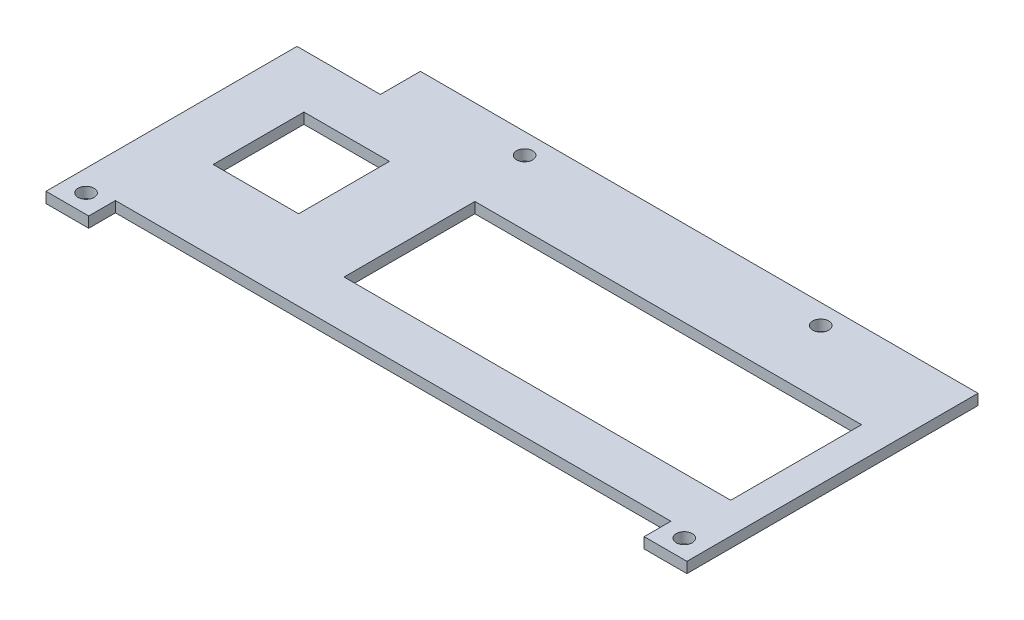
ISO-10303-21;
HEADER;
FILE_DESCRIPTION(('STEP AP214'),'2;1');
FILE_NAME('part.step','',(''),(''),'','','');
FILE_SCHEMA(('AUTOMOTIVE_DESIGN { 1 0 10303 214 1 1 1 1 }'));
ENDSEC;
DATA;
#1=APPLICATION_CONTEXT('core data for automotive mechanical design processes');
#2=APPLICATION_PROTOCOL_DEFINITION('international standard','automotive_design',2000,#1);
#3=PRODUCT_CONTEXT('',#1,'mechanical');
#4=PRODUCT('Part','Part','',(#3));
#5=PRODUCT_RELATED_PRODUCT_CATEGORY('part','',(#4));
#6=PRODUCT_DEFINITION_FORMATION('','',#4);
#7=PRODUCT_DEFINITION_CONTEXT('part definition',#1,'design');
#8=PRODUCT_DEFINITION('design','',#6,#7);
#9=PRODUCT_DEFINITION_SHAPE('','',#8);
#10=(LENGTH_UNIT() NAMED_UNIT(*) SI_UNIT(.MILLI.,.METRE.));
#11=(NAMED_UNIT(*) PLANE_ANGLE_UNIT() SI_UNIT($,.RADIAN.));
#12=(NAMED_UNIT(*) SI_UNIT($,.STERADIAN.) SOLID_ANGLE_UNIT());
#13=UNCERTAINTY_MEASURE_WITH_UNIT(LENGTH_MEASURE(1.E-05),#10,'distance_accuracy_value','');
#14=(GEOMETRIC_REPRESENTATION_CONTEXT(3) GLOBAL_UNCERTAINTY_ASSIGNED_CONTEXT((#13)) GLOBAL_UNIT_ASSIGNED_CONTEXT((#10,
#11,#12)) REPRESENTATION_CONTEXT('',''));
#15=CARTESIAN_POINT('',(0.,0.,0.));
#16=DIRECTION('',(0.,0.,1.));
#17=DIRECTION('',(1.,0.,0.));
#18=AXIS2_PLACEMENT_3D('',#15,#16,#17);
#19=CARTESIAN_POINT('',(0.,21.5,0.));
#20=DIRECTION('',(0.,-1.,0.));
#21=DIRECTION('',(0.,0.,-1.));
#22=AXIS2_PLACEMENT_3D('',#19,#20,#21);
#23=PLANE('',#22);
#24=DIRECTION('',(0.,0.,1.));
#25=VECTOR('',#24,1.);
#26=CARTESIAN_POINT('',(-44.4,21.5,18.));
#27=LINE('',#26,#25);
#28=CARTESIAN_POINT('',(-44.4,21.5,18.));
#29=VERTEX_POINT('',#28);
#30=CARTESIAN_POINT('',(-44.4,21.5,25.5));
#31=VERTEX_POINT('',#30);
#32=EDGE_CURVE('E54',#29,#31,#27,.T.);
#33=ORIENTED_EDGE('',*,*,#32,.F.);
#34=DIRECTION('',(-1.,0.,0.));
#35=VECTOR('',#34,1.);
#36=CARTESIAN_POINT('',(58.,21.5,18.));
#37=LINE('',#36,#35);
#38=CARTESIAN_POINT('',(60.,21.5,18.));
#39=VERTEX_POINT('',#38);
#40=EDGE_CURVE('E152',#39,#29,#37,.T.);
#41=ORIENTED_EDGE('',*,*,#40,.F.);
#42=DIRECTION('',(0.,0.,-1.));
#43=VECTOR('',#42,1.);
#44=CARTESIAN_POINT('',(60.,21.5,72.5));
#45=LINE('',#44,#43);
#46=CARTESIAN_POINT('',(60.,21.5,72.5));
#47=VERTEX_POINT('',#46);
#48=EDGE_CURVE('E214',#47,#39,#45,.T.);
#49=ORIENTED_EDGE('',*,*,#48,.F.);
#50=DIRECTION('',(1.,0.,0.));
#51=VECTOR('',#50,1.);
#52=CARTESIAN_POINT('',(52.,21.5,72.5));
#53=LINE('',#52,#51);
#54=CARTESIAN_POINT('',(52.,21.5,72.5));
#55=VERTEX_POINT('',#54);
#56=EDGE_CURVE('E183',#55,#47,#53,.T.);
#57=ORIENTED_EDGE('',*,*,#56,.F.);
#58=DIRECTION('',(0.,0.,1.));
#59=VECTOR('',#58,1.);
#60=CARTESIAN_POINT('',(52.,21.5,67.5));
#61=LINE('',#60,#59);
#62=CARTESIAN_POINT('',(52.,21.5,67.5));
#63=VERTEX_POINT('',#62);
#64=EDGE_CURVE('E227',#63,#55,#61,.T.);
#65=ORIENTED_EDGE('',*,*,#64,.F.);
#66=DIRECTION('',(1.,0.,0.));
#67=VECTOR('',#66,1.);
#68=CARTESIAN_POINT('',(-52.,21.5,67.5));
#69=LINE('',#68,#67);
#70=CARTESIAN_POINT('',(-52.,21.5,67.5));
#71=VERTEX_POINT('',#70);
#72=EDGE_CURVE('E225',#71,#63,#69,.T.);
#73=ORIENTED_EDGE('',*,*,#72,.F.);
#74=DIRECTION('',(0.,0.,-1.));
#75=VECTOR('',#74,1.);
#76=CARTESIAN_POINT('',(-52.,21.5,72.5));
#77=LINE('',#76,#75);
#78=CARTESIAN_POINT('',(-52.,21.5,72.5));
#79=VERTEX_POINT('',#78);
#80=EDGE_CURVE('E223',#79,#71,#77,.T.);
#81=ORIENTED_EDGE('',*,*,#80,.F.);
#82=DIRECTION('',(1.,0.,0.));
#83=VECTOR('',#82,1.);
#84=CARTESIAN_POINT('',(-60.,21.5,72.5));
#85=LINE('',#84,#83);
#86=CARTESIAN_POINT('',(-60.,21.5,72.5));
#87=VERTEX_POINT('',#86);
#88=EDGE_CURVE('E189',#87,#79,#85,.T.);
#89=ORIENTED_EDGE('',*,*,#88,.F.);
#90=DIRECTION('',(0.,0.,1.));
#91=VECTOR('',#90,1.);
#92=CARTESIAN_POINT('',(-60.,21.5,52.5));
#93=LINE('',#92,#91);
#94=CARTESIAN_POINT('',(-60.,21.5,25.5));
#95=VERTEX_POINT('',#94);
#96=EDGE_CURVE('E186',#95,#87,#93,.T.);
#97=ORIENTED_EDGE('',*,*,#96,.F.);
#98=DIRECTION('',(1.,0.,0.));
#99=VECTOR('',#98,1.);
#100=CARTESIAN_POINT('',(-16.9,21.5,25.5));
#101=LINE('',#100,#99);
#102=EDGE_CURVE('E174',#95,#31,#101,.T.);
#103=ORIENTED_EDGE('',*,*,#102,.T.);
#104=EDGE_LOOP('',(#33,#41,#49,#57,#65,#73,#81,#89,#97,#103));
#105=FACE_BOUND('',#104,.T.);
#106=CARTESIAN_POINT('',(-21.029637867963,21.5,21.8623873910983));
#107=DIRECTION('',(0.,1.,0.));
#108=DIRECTION('',(0.,0.,1.));
#109=AXIS2_PLACEMENT_3D('',#106,#107,#108);
#110=CIRCLE('',#109,1.5);
#111=CARTESIAN_POINT('',(-21.029637867963,21.5,23.3623873910983));
#112=VERTEX_POINT('',#111);
#113=EDGE_CURVE('E315',#112,#112,#110,.T.);
#114=ORIENTED_EDGE('',*,*,#113,.T.);
#115=EDGE_LOOP('',(#114));
#116=FACE_BOUND('',#115,.T.);
#117=CARTESIAN_POINT('',(34.3,21.5,21.75));
#118=DIRECTION('',(0.,1.,0.));
#119=DIRECTION('',(0.,0.,1.));
#120=AXIS2_PLACEMENT_3D('',#117,#118,#119);
#121=CIRCLE('',#120,1.5);
#122=CARTESIAN_POINT('',(34.3,21.5,23.25));
#123=VERTEX_POINT('',#122);
#124=EDGE_CURVE('E588',#123,#123,#121,.T.);
#125=ORIENTED_EDGE('',*,*,#124,.T.);
#126=EDGE_LOOP('',(#125));
#127=FACE_BOUND('',#126,.T.);
#128=CARTESIAN_POINT('',(-56.,21.5,69.));
#129=DIRECTION('',(0.,1.,0.));
#130=DIRECTION('',(0.,0.,1.));
#131=AXIS2_PLACEMENT_3D('',#128,#129,#130);
#132=CIRCLE('',#131,1.5);
#133=CARTESIAN_POINT('',(-56.,21.5,70.5));
#134=VERTEX_POINT('',#133);
#135=EDGE_CURVE('E45',#134,#134,#132,.T.);
#136=ORIENTED_EDGE('',*,*,#135,.T.);
#137=EDGE_LOOP('',(#136));
#138=FACE_BOUND('',#137,.T.);
#139=CARTESIAN_POINT('',(56.,21.5,69.));
#140=DIRECTION('',(0.,1.,0.));
#141=DIRECTION('',(0.,0.,1.));
#142=AXIS2_PLACEMENT_3D('',#139,#140,#141);
#143=CIRCLE('',#142,1.5);
#144=CARTESIAN_POINT('',(56.,21.5,70.5));
#145=VERTEX_POINT('',#144);
#146=EDGE_CURVE('E11',#145,#145,#143,.T.);
#147=ORIENTED_EDGE('',*,*,#146,.T.);
#148=EDGE_LOOP('',(#147));
#149=FACE_BOUND('',#148,.T.);
#150=DIRECTION('',(1.,0.,0.));
#151=VECTOR('',#150,1.);
#152=CARTESIAN_POINT('',(54.2,21.5,58.5));
#153=LINE('',#152,#151);
#154=CARTESIAN_POINT('',(-18.2,21.5,58.5));
#155=VERTEX_POINT('',#154);
#156=CARTESIAN_POINT('',(54.2,21.5,58.5));
#157=VERTEX_POINT('',#156);
#158=EDGE_CURVE('E258',#155,#157,#153,.T.);
#159=ORIENTED_EDGE('',*,*,#158,.T.);
#160=DIRECTION('',(0.,0.,-1.));
#161=VECTOR('',#160,1.);
#162=CARTESIAN_POINT('',(54.2,21.5,34.));
#163=LINE('',#162,#161);
#164=CARTESIAN_POINT('',(54.2,21.5,34.));
#165=VERTEX_POINT('',#164);
#166=EDGE_CURVE('E254',#157,#165,#163,.T.);
#167=ORIENTED_EDGE('',*,*,#166,.T.);
#168=DIRECTION('',(-1.,0.,0.));
#169=VECTOR('',#168,1.);
#170=CARTESIAN_POINT('',(54.2,21.5,34.));
#171=LINE('',#170,#169);
#172=CARTESIAN_POINT('',(-18.2,21.5,34.));
#173=VERTEX_POINT('',#172);
#174=EDGE_CURVE('E268',#165,#173,#171,.T.);
#175=ORIENTED_EDGE('',*,*,#174,.T.);
#176=DIRECTION('',(0.,0.,1.));
#177=VECTOR('',#176,1.);
#178=CARTESIAN_POINT('',(-18.2,21.5,34.));
#179=LINE('',#178,#177);
#180=EDGE_CURVE('E271',#173,#155,#179,.T.);
#181=ORIENTED_EDGE('',*,*,#180,.T.);
#182=EDGE_LOOP('',(#159,#167,#175,#181));
#183=FACE_BOUND('',#182,.T.);
#184=DIRECTION('',(-1.,0.,0.));
#185=VECTOR('',#184,1.);
#186=CARTESIAN_POINT('',(-48.7,21.5,35.5));
#187=LINE('',#186,#185);
#188=CARTESIAN_POINT('',(-32.7,21.5,35.5));
#189=VERTEX_POINT('',#188);
#190=CARTESIAN_POINT('',(-48.7,21.5,35.5));
#191=VERTEX_POINT('',#190);
#192=EDGE_CURVE('E232',#189,#191,#187,.T.);
#193=ORIENTED_EDGE('',*,*,#192,.T.);
#194=DIRECTION('',(0.,0.,1.));
#195=VECTOR('',#194,1.);
#196=CARTESIAN_POINT('',(-48.7,21.5,35.5));
#197=LINE('',#196,#195);
#198=CARTESIAN_POINT('',(-48.7,21.5,52.5));
#199=VERTEX_POINT('',#198);
#200=EDGE_CURVE('E138',#191,#199,#197,.T.);
#201=ORIENTED_EDGE('',*,*,#200,.T.);
#202=DIRECTION('',(1.,0.,0.));
#203=VECTOR('',#202,1.);
#204=CARTESIAN_POINT('',(-48.7,21.5,52.5));
#205=LINE('',#204,#203);
#206=CARTESIAN_POINT('',(-32.7,21.5,52.5));
#207=VERTEX_POINT('',#206);
#208=EDGE_CURVE('E240',#199,#207,#205,.T.);
#209=ORIENTED_EDGE('',*,*,#208,.T.);
#210=DIRECTION('',(0.,0.,-1.));
#211=VECTOR('',#210,1.);
#212=CARTESIAN_POINT('',(-32.7,21.5,35.5));
#213=LINE('',#212,#211);
#214=EDGE_CURVE('E243',#207,#189,#213,.T.);
#215=ORIENTED_EDGE('',*,*,#214,.T.);
#216=EDGE_LOOP('',(#193,#201,#209,#215));
#217=FACE_BOUND('',#216,.T.);
#218=ADVANCED_FACE('F35',(#105,#116,#127,#138,#149,#183,#217),#23,.T.);
#219=CARTESIAN_POINT('',(-32.7,23.5,35.5));
#220=DIRECTION('',(-1.,0.,0.));
#221=DIRECTION('',(0.,0.,1.));
#222=AXIS2_PLACEMENT_3D('',#219,#220,#221);
#223=PLANE('',#222);
#224=ORIENTED_EDGE('',*,*,#214,.F.);
#225=DIRECTION('',(0.,-1.,0.));
#226=VECTOR('',#225,1.);
#227=CARTESIAN_POINT('',(-32.7,23.5,52.5));
#228=LINE('',#227,#226);
#229=CARTESIAN_POINT('',(-32.7,23.5,52.5));
#230=VERTEX_POINT('',#229);
#231=EDGE_CURVE('E250',#230,#207,#228,.T.);
#232=ORIENTED_EDGE('',*,*,#231,.F.);
#233=DIRECTION('',(0.,0.,-1.));
#234=VECTOR('',#233,1.);
#235=CARTESIAN_POINT('',(-32.7,23.5,35.5));
#236=LINE('',#235,#234);
#237=CARTESIAN_POINT('',(-32.7,23.5,35.5));
#238=VERTEX_POINT('',#237);
#239=EDGE_CURVE('E234',#230,#238,#236,.T.);
#240=ORIENTED_EDGE('',*,*,#239,.T.);
#241=DIRECTION('',(0.,-1.,0.));
#242=VECTOR('',#241,1.);
#243=CARTESIAN_POINT('',(-32.7,23.5,35.5));
#244=LINE('',#243,#242);
#245=EDGE_CURVE('E144',#238,#189,#244,.T.);
#246=ORIENTED_EDGE('',*,*,#245,.T.);
#247=EDGE_LOOP('',(#224,#232,#240,#246));
#248=FACE_BOUND('',#247,.T.);
#249=ADVANCED_FACE('F360',(#248),#223,.T.);
#250=CARTESIAN_POINT('',(-48.7,23.5,52.5));
#251=DIRECTION('',(0.,0.,-1.));
#252=DIRECTION('',(-1.,0.,0.));
#253=AXIS2_PLACEMENT_3D('',#250,#251,#252);
#254=PLANE('',#253);
#255=ORIENTED_EDGE('',*,*,#208,.F.);
#256=DIRECTION('',(0.,-1.,0.));
#257=VECTOR('',#256,1.);
#258=CARTESIAN_POINT('',(-48.7,23.5,52.5));
#259=LINE('',#258,#257);
#260=CARTESIAN_POINT('',(-48.7,23.5,52.5));
#261=VERTEX_POINT('',#260);
#262=EDGE_CURVE('E252',#261,#199,#259,.T.);
#263=ORIENTED_EDGE('',*,*,#262,.F.);
#264=DIRECTION('',(1.,0.,0.));
#265=VECTOR('',#264,1.);
#266=CARTESIAN_POINT('',(-48.7,23.5,52.5));
#267=LINE('',#266,#265);
#268=EDGE_CURVE('E231',#261,#230,#267,.T.);
#269=ORIENTED_EDGE('',*,*,#268,.T.);
#270=ORIENTED_EDGE('',*,*,#231,.T.);
#271=EDGE_LOOP('',(#255,#263,#269,#270));
#272=FACE_BOUND('',#271,.T.);
#273=ADVANCED_FACE('F366',(#272),#254,.T.);
#274=CARTESIAN_POINT('',(-48.7,23.5,35.5));
#275=DIRECTION('',(1.,0.,0.));
#276=DIRECTION('',(0.,0.,-1.));
#277=AXIS2_PLACEMENT_3D('',#274,#275,#276);
#278=PLANE('',#277);
#279=ORIENTED_EDGE('',*,*,#200,.F.);
#280=DIRECTION('',(0.,-1.,0.));
#281=VECTOR('',#280,1.);
#282=CARTESIAN_POINT('',(-48.7,23.5,35.5));
#283=LINE('',#282,#281);
#284=CARTESIAN_POINT('',(-48.7,23.5,35.5));
#285=VERTEX_POINT('',#284);
#286=EDGE_CURVE('E238',#285,#191,#283,.T.);
#287=ORIENTED_EDGE('',*,*,#286,.F.);
#288=DIRECTION('',(0.,0.,1.));
#289=VECTOR('',#288,1.);
#290=CARTESIAN_POINT('',(-48.7,23.5,35.5));
#291=LINE('',#290,#289);
#292=EDGE_CURVE('E229',#285,#261,#291,.T.);
#293=ORIENTED_EDGE('',*,*,#292,.T.);
#294=ORIENTED_EDGE('',*,*,#262,.T.);
#295=EDGE_LOOP('',(#279,#287,#293,#294));
#296=FACE_BOUND('',#295,.T.);
#297=ADVANCED_FACE('F372',(#296),#278,.T.);
#298=CARTESIAN_POINT('',(-48.7,23.5,35.5));
#299=DIRECTION('',(0.,0.,1.));
#300=DIRECTION('',(1.,0.,0.));
#301=AXIS2_PLACEMENT_3D('',#298,#299,#300);
#302=PLANE('',#301);
#303=ORIENTED_EDGE('',*,*,#192,.F.);
#304=ORIENTED_EDGE('',*,*,#245,.F.);
#305=DIRECTION('',(-1.,0.,0.));
#306=VECTOR('',#305,1.);
#307=CARTESIAN_POINT('',(-48.7,23.5,35.5));
#308=LINE('',#307,#306);
#309=EDGE_CURVE('E236',#238,#285,#308,.T.);
#310=ORIENTED_EDGE('',*,*,#309,.T.);
#311=ORIENTED_EDGE('',*,*,#286,.T.);
#312=EDGE_LOOP('',(#303,#304,#310,#311));
#313=FACE_BOUND('',#312,.T.);
#314=ADVANCED_FACE('F362',(#313),#302,.T.);
#315=CARTESIAN_POINT('',(-18.2,23.5,34.));
#316=DIRECTION('',(1.,0.,0.));
#317=DIRECTION('',(0.,0.,-1.));
#318=AXIS2_PLACEMENT_3D('',#315,#316,#317);
#319=PLANE('',#318);
#320=ORIENTED_EDGE('',*,*,#180,.F.);
#321=DIRECTION('',(0.,-1.,0.));
#322=VECTOR('',#321,1.);
#323=CARTESIAN_POINT('',(-18.2,23.5,34.));
#324=LINE('',#323,#322);
#325=CARTESIAN_POINT('',(-18.2,23.5,34.));
#326=VERTEX_POINT('',#325);
#327=EDGE_CURVE('E280',#326,#173,#324,.T.);
#328=ORIENTED_EDGE('',*,*,#327,.F.);
#329=DIRECTION('',(0.,0.,1.));
#330=VECTOR('',#329,1.);
#331=CARTESIAN_POINT('',(-18.2,23.5,34.));
#332=LINE('',#331,#330);
#333=CARTESIAN_POINT('',(-18.2,23.5,58.5));
#334=VERTEX_POINT('',#333);
#335=EDGE_CURVE('E260',#326,#334,#332,.T.);
#336=ORIENTED_EDGE('',*,*,#335,.T.);
#337=DIRECTION('',(0.,-1.,0.));
#338=VECTOR('',#337,1.);
#339=CARTESIAN_POINT('',(-18.2,23.5,58.5));
#340=LINE('',#339,#338);
#341=EDGE_CURVE('E278',#334,#155,#340,.T.);
#342=ORIENTED_EDGE('',*,*,#341,.T.);
#343=EDGE_LOOP('',(#320,#328,#336,#342));
#344=FACE_BOUND('',#343,.T.);
#345=ADVANCED_FACE('F371',(#344),#319,.T.);
#346=CARTESIAN_POINT('',(54.2,23.5,34.));
#347=DIRECTION('',(0.,0.,1.));
#348=DIRECTION('',(1.,0.,0.));
#349=AXIS2_PLACEMENT_3D('',#346,#347,#348);
#350=PLANE('',#349);
#351=ORIENTED_EDGE('',*,*,#174,.F.);
#352=DIRECTION('',(0.,-1.,0.));
#353=VECTOR('',#352,1.);
#354=CARTESIAN_POINT('',(54.2,23.5,34.));
#355=LINE('',#354,#353);
#356=CARTESIAN_POINT('',(54.2,23.5,34.));
#357=VERTEX_POINT('',#356);
#358=EDGE_CURVE('E282',#357,#165,#355,.T.);
#359=ORIENTED_EDGE('',*,*,#358,.F.);
#360=DIRECTION('',(-1.,0.,0.));
#361=VECTOR('',#360,1.);
#362=CARTESIAN_POINT('',(54.2,23.5,34.));
#363=LINE('',#362,#361);
#364=EDGE_CURVE('E257',#357,#326,#363,.T.);
#365=ORIENTED_EDGE('',*,*,#364,.T.);
#366=ORIENTED_EDGE('',*,*,#327,.T.);
#367=EDGE_LOOP('',(#351,#359,#365,#366));
#368=FACE_BOUND('',#367,.T.);
#369=ADVANCED_FACE('F377',(#368),#350,.T.);
#370=CARTESIAN_POINT('',(54.2,23.5,34.));
#371=DIRECTION('',(-1.,0.,0.));
#372=DIRECTION('',(0.,0.,1.));
#373=AXIS2_PLACEMENT_3D('',#370,#371,#372);
#374=PLANE('',#373);
#375=ORIENTED_EDGE('',*,*,#166,.F.);
#376=DIRECTION('',(0.,-1.,0.));
#377=VECTOR('',#376,1.);
#378=CARTESIAN_POINT('',(54.2,23.5,58.5));
#379=LINE('',#378,#377);
#380=CARTESIAN_POINT('',(54.2,23.5,58.5));
#381=VERTEX_POINT('',#380);
#382=EDGE_CURVE('E265',#381,#157,#379,.T.);
#383=ORIENTED_EDGE('',*,*,#382,.F.);
#384=DIRECTION('',(0.,0.,-1.));
#385=VECTOR('',#384,1.);
#386=CARTESIAN_POINT('',(54.2,23.5,34.));
#387=LINE('',#386,#385);
#388=EDGE_CURVE('E255',#381,#357,#387,.T.);
#389=ORIENTED_EDGE('',*,*,#388,.T.);
#390=ORIENTED_EDGE('',*,*,#358,.T.);
#391=EDGE_LOOP('',(#375,#383,#389,#390));
#392=FACE_BOUND('',#391,.T.);
#393=ADVANCED_FACE('F386',(#392),#374,.T.);
#394=CARTESIAN_POINT('',(54.2,23.5,58.5));
#395=DIRECTION('',(0.,0.,-1.));
#396=DIRECTION('',(-1.,0.,0.));
#397=AXIS2_PLACEMENT_3D('',#394,#395,#396);
#398=PLANE('',#397);
#399=ORIENTED_EDGE('',*,*,#158,.F.);
#400=ORIENTED_EDGE('',*,*,#341,.F.);
#401=DIRECTION('',(1.,0.,0.));
#402=VECTOR('',#401,1.);
#403=CARTESIAN_POINT('',(54.2,23.5,58.5));
#404=LINE('',#403,#402);
#405=EDGE_CURVE('E263',#334,#381,#404,.T.);
#406=ORIENTED_EDGE('',*,*,#405,.T.);
#407=ORIENTED_EDGE('',*,*,#382,.T.);
#408=EDGE_LOOP('',(#399,#400,#406,#407));
#409=FACE_BOUND('',#408,.T.);
#410=ADVANCED_FACE('F353',(#409),#398,.T.);
#411=CARTESIAN_POINT('',(60.,23.5,18.));
#412=DIRECTION('',(-1.,0.,0.));
#413=DIRECTION('',(0.,0.,1.));
#414=AXIS2_PLACEMENT_3D('',#411,#412,#413);
#415=PLANE('',#414);
#416=ORIENTED_EDGE('',*,*,#48,.T.);
#417=DIRECTION('',(0.,-1.,0.));
#418=VECTOR('',#417,1.);
#419=CARTESIAN_POINT('',(60.,23.5,18.));
#420=LINE('',#419,#418);
#421=CARTESIAN_POINT('',(60.,23.5,18.));
#422=VERTEX_POINT('',#421);
#423=EDGE_CURVE('E39',#422,#39,#420,.T.);
#424=ORIENTED_EDGE('',*,*,#423,.F.);
#425=DIRECTION('',(0.,0.,-1.));
#426=VECTOR('',#425,1.);
#427=CARTESIAN_POINT('',(60.,23.5,18.));
#428=LINE('',#427,#426);
#429=CARTESIAN_POINT('',(60.,23.5,72.5));
#430=VERTEX_POINT('',#429);
#431=EDGE_CURVE('E212',#430,#422,#428,.T.);
#432=ORIENTED_EDGE('',*,*,#431,.F.);
#433=DIRECTION('',(0.,-1.,0.));
#434=VECTOR('',#433,1.);
#435=CARTESIAN_POINT('',(60.,23.5,72.5));
#436=LINE('',#435,#434);
#437=EDGE_CURVE('E216',#430,#47,#436,.T.);
#438=ORIENTED_EDGE('',*,*,#437,.T.);
#439=EDGE_LOOP('',(#416,#424,#432,#438));
#440=FACE_BOUND('',#439,.T.);
#441=ADVANCED_FACE('F37',(#440),#415,.F.);
#442=CARTESIAN_POINT('',(-44.4,23.5,18.));
#443=DIRECTION('',(1.,0.,0.));
#444=DIRECTION('',(0.,0.,-1.));
#445=AXIS2_PLACEMENT_3D('',#442,#443,#444);
#446=PLANE('',#445);
#447=ORIENTED_EDGE('',*,*,#32,.T.);
#448=DIRECTION('',(0.,-1.,0.));
#449=VECTOR('',#448,1.);
#450=CARTESIAN_POINT('',(-44.4,23.5,25.5));
#451=LINE('',#450,#449);
#452=CARTESIAN_POINT('',(-44.4,23.5,25.5));
#453=VERTEX_POINT('',#452);
#454=EDGE_CURVE('E181',#453,#31,#451,.T.);
#455=ORIENTED_EDGE('',*,*,#454,.F.);
#456=DIRECTION('',(0.,0.,1.));
#457=VECTOR('',#456,1.);
#458=CARTESIAN_POINT('',(-44.4,23.5,18.));
#459=LINE('',#458,#457);
#460=CARTESIAN_POINT('',(-44.4,23.5,18.));
#461=VERTEX_POINT('',#460);
#462=EDGE_CURVE('E299',#461,#453,#459,.T.);
#463=ORIENTED_EDGE('',*,*,#462,.F.);
#464=DIRECTION('',(0.,-1.,0.));
#465=VECTOR('',#464,1.);
#466=CARTESIAN_POINT('',(-44.4,23.5,18.));
#467=LINE('',#466,#465);
#468=EDGE_CURVE('E198',#461,#29,#467,.T.);
#469=ORIENTED_EDGE('',*,*,#468,.T.);
#470=EDGE_LOOP('',(#447,#455,#463,#469));
#471=FACE_BOUND('',#470,.T.);
#472=ADVANCED_FACE('F345',(#471),#446,.F.);
#473=CARTESIAN_POINT('',(-52.,23.5,72.5));
#474=DIRECTION('',(-1.,0.,0.));
#475=DIRECTION('',(0.,0.,1.));
#476=AXIS2_PLACEMENT_3D('',#473,#474,#475);
#477=PLANE('',#476);
#478=ORIENTED_EDGE('',*,*,#80,.T.);
#479=DIRECTION('',(0.,-1.,0.));
#480=VECTOR('',#479,1.);
#481=CARTESIAN_POINT('',(-52.,23.5,67.5));
#482=LINE('',#481,#480);
#483=CARTESIAN_POINT('',(-52.,23.5,67.5));
#484=VERTEX_POINT('',#483);
#485=EDGE_CURVE('E323',#484,#71,#482,.T.);
#486=ORIENTED_EDGE('',*,*,#485,.F.);
#487=DIRECTION('',(0.,0.,-1.));
#488=VECTOR('',#487,1.);
#489=CARTESIAN_POINT('',(-52.,23.5,72.5));
#490=LINE('',#489,#488);
#491=CARTESIAN_POINT('',(-52.,23.5,72.5));
#492=VERTEX_POINT('',#491);
#493=EDGE_CURVE('E306',#492,#484,#490,.T.);
#494=ORIENTED_EDGE('',*,*,#493,.F.);
#495=DIRECTION('',(0.,-1.,0.));
#496=VECTOR('',#495,1.);
#497=CARTESIAN_POINT('',(-52.,23.5,72.5));
#498=LINE('',#497,#496);
#499=EDGE_CURVE('E200',#492,#79,#498,.T.);
#500=ORIENTED_EDGE('',*,*,#499,.T.);
#501=EDGE_LOOP('',(#478,#486,#494,#500));
#502=FACE_BOUND('',#501,.T.);
#503=ADVANCED_FACE('F329',(#502),#477,.F.);
#504=CARTESIAN_POINT('',(-52.,23.5,67.5));
#505=DIRECTION('',(0.,0.,-1.));
#506=DIRECTION('',(-1.,0.,0.));
#507=AXIS2_PLACEMENT_3D('',#504,#505,#506);
#508=PLANE('',#507);
#509=ORIENTED_EDGE('',*,*,#72,.T.);
#510=DIRECTION('',(0.,-1.,0.));
#511=VECTOR('',#510,1.);
#512=CARTESIAN_POINT('',(52.,23.5,67.5));
#513=LINE('',#512,#511);
#514=CARTESIAN_POINT('',(52.,23.5,67.5));
#515=VERTEX_POINT('',#514);
#516=EDGE_CURVE('E320',#515,#63,#513,.T.);
#517=ORIENTED_EDGE('',*,*,#516,.F.);
#518=DIRECTION('',(1.,0.,0.));
#519=VECTOR('',#518,1.);
#520=CARTESIAN_POINT('',(-52.,23.5,67.5));
#521=LINE('',#520,#519);
#522=EDGE_CURVE('E308',#484,#515,#521,.T.);
#523=ORIENTED_EDGE('',*,*,#522,.F.);
#524=ORIENTED_EDGE('',*,*,#485,.T.);
#525=EDGE_LOOP('',(#509,#517,#523,#524));
#526=FACE_BOUND('',#525,.T.);
#527=ADVANCED_FACE('F339',(#526),#508,.F.);
#528=CARTESIAN_POINT('',(-44.4,23.5,25.5));
#529=DIRECTION('',(0.,0.,1.));
#530=DIRECTION('',(1.,0.,0.));
#531=AXIS2_PLACEMENT_3D('',#528,#529,#530);
#532=PLANE('',#531);
#533=ORIENTED_EDGE('',*,*,#102,.F.);
#534=DIRECTION('',(0.,-1.,0.));
#535=VECTOR('',#534,1.);
#536=CARTESIAN_POINT('',(-60.,23.5,25.5));
#537=LINE('',#536,#535);
#538=CARTESIAN_POINT('',(-60.,23.5,25.5));
#539=VERTEX_POINT('',#538);
#540=EDGE_CURVE('E179',#539,#95,#537,.T.);
#541=ORIENTED_EDGE('',*,*,#540,.F.);
#542=DIRECTION('',(-1.,0.,0.));
#543=VECTOR('',#542,1.);
#544=CARTESIAN_POINT('',(-44.4,23.5,25.5));
#545=LINE('',#544,#543);
#546=EDGE_CURVE('E301',#453,#539,#545,.T.);
#547=ORIENTED_EDGE('',*,*,#546,.F.);
#548=ORIENTED_EDGE('',*,*,#454,.T.);
#549=EDGE_LOOP('',(#533,#541,#547,#548));
#550=FACE_BOUND('',#549,.T.);
#551=ADVANCED_FACE('F176',(#550),#532,.F.);
#552=CARTESIAN_POINT('',(0.,23.5,0.));
#553=DIRECTION('',(0.,-1.,0.));
#554=DIRECTION('',(0.,0.,-1.));
#555=AXIS2_PLACEMENT_3D('',#552,#553,#554);
#556=PLANE('',#555);
#557=ORIENTED_EDGE('',*,*,#388,.F.);
#558=ORIENTED_EDGE('',*,*,#405,.F.);
#559=ORIENTED_EDGE('',*,*,#335,.F.);
#560=ORIENTED_EDGE('',*,*,#364,.F.);
#561=EDGE_LOOP('',(#557,#558,#559,#560));
#562=FACE_BOUND('',#561,.T.);
#563=ORIENTED_EDGE('',*,*,#431,.T.);
#564=DIRECTION('',(-1.,0.,0.));
#565=VECTOR('',#564,1.);
#566=CARTESIAN_POINT('',(60.,23.5,18.));
#567=LINE('',#566,#565);
#568=EDGE_CURVE('E206',#422,#461,#567,.T.);
#569=ORIENTED_EDGE('',*,*,#568,.T.);
#570=ORIENTED_EDGE('',*,*,#462,.T.);
#571=ORIENTED_EDGE('',*,*,#546,.T.);
#572=DIRECTION('',(0.,0.,1.));
#573=VECTOR('',#572,1.);
#574=CARTESIAN_POINT('',(-60.,23.5,25.5));
#575=LINE('',#574,#573);
#576=CARTESIAN_POINT('',(-60.,23.5,72.5));
#577=VERTEX_POINT('',#576);
#578=EDGE_CURVE('E195',#539,#577,#575,.T.);
#579=ORIENTED_EDGE('',*,*,#578,.T.);
#580=DIRECTION('',(1.,0.,0.));
#581=VECTOR('',#580,1.);
#582=CARTESIAN_POINT('',(-52.,23.5,72.5));
#583=LINE('',#582,#581);
#584=EDGE_CURVE('E304',#577,#492,#583,.T.);
#585=ORIENTED_EDGE('',*,*,#584,.T.);
#586=ORIENTED_EDGE('',*,*,#493,.T.);
#587=ORIENTED_EDGE('',*,*,#522,.T.);
#588=DIRECTION('',(0.,0.,1.));
#589=VECTOR('',#588,1.);
#590=CARTESIAN_POINT('',(52.,23.5,67.5));
#591=LINE('',#590,#589);
#592=CARTESIAN_POINT('',(52.,23.5,72.5));
#593=VERTEX_POINT('',#592);
#594=EDGE_CURVE('E310',#515,#593,#591,.T.);
#595=ORIENTED_EDGE('',*,*,#594,.T.);
#596=DIRECTION('',(1.,0.,0.));
#597=VECTOR('',#596,1.);
#598=CARTESIAN_POINT('',(60.,23.5,72.5));
#599=LINE('',#598,#597);
#600=EDGE_CURVE('E312',#593,#430,#599,.T.);
#601=ORIENTED_EDGE('',*,*,#600,.T.);
#602=EDGE_LOOP('',(#563,#569,#570,#571,#579,#585,#586,#587,#595,#601));
#603=FACE_BOUND('',#602,.T.);
#604=CARTESIAN_POINT('',(-56.,23.5,69.));
#605=DIRECTION('',(0.,1.,0.));
#606=DIRECTION('',(0.,0.,1.));
#607=AXIS2_PLACEMENT_3D('',#604,#605,#606);
#608=CIRCLE('',#607,1.5);
#609=CARTESIAN_POINT('',(-56.,23.5,70.5));
#610=VERTEX_POINT('',#609);
#611=EDGE_CURVE('E294',#610,#610,#608,.T.);
#612=ORIENTED_EDGE('',*,*,#611,.F.);
#613=EDGE_LOOP('',(#612));
#614=FACE_BOUND('',#613,.T.);
#615=CARTESIAN_POINT('',(56.,23.5,69.));
#616=DIRECTION('',(0.,1.,0.));
#617=DIRECTION('',(0.,0.,1.));
#618=AXIS2_PLACEMENT_3D('',#615,#616,#617);
#619=CIRCLE('',#618,1.5);
#620=CARTESIAN_POINT('',(56.,23.5,70.5));
#621=VERTEX_POINT('',#620);
#622=EDGE_CURVE('E291',#621,#621,#619,.T.);
#623=ORIENTED_EDGE('',*,*,#622,.F.);
#624=EDGE_LOOP('',(#623));
#625=FACE_BOUND('',#624,.T.);
#626=CARTESIAN_POINT('',(34.3,23.5,21.75));
#627=DIRECTION('',(0.,1.,0.));
#628=DIRECTION('',(0.,0.,1.));
#629=AXIS2_PLACEMENT_3D('',#626,#627,#628);
#630=CIRCLE('',#629,1.5);
#631=CARTESIAN_POINT('',(34.3,23.5,23.25));
#632=VERTEX_POINT('',#631);
#633=EDGE_CURVE('E288',#632,#632,#630,.T.);
#634=ORIENTED_EDGE('',*,*,#633,.F.);
#635=EDGE_LOOP('',(#634));
#636=FACE_BOUND('',#635,.T.);
#637=CARTESIAN_POINT('',(-21.029637867963,23.5,21.8623873910983));
#638=DIRECTION('',(0.,1.,0.));
#639=DIRECTION('',(0.,0.,1.));
#640=AXIS2_PLACEMENT_3D('',#637,#638,#639);
#641=CIRCLE('',#640,1.5);
#642=CARTESIAN_POINT('',(-21.029637867963,23.5,23.3623873910983));
#643=VERTEX_POINT('',#642);
#644=EDGE_CURVE('E285',#643,#643,#641,.T.);
#645=ORIENTED_EDGE('',*,*,#644,.F.);
#646=EDGE_LOOP('',(#645));
#647=FACE_BOUND('',#646,.T.);
#648=ORIENTED_EDGE('',*,*,#292,.F.);
#649=ORIENTED_EDGE('',*,*,#309,.F.);
#650=ORIENTED_EDGE('',*,*,#239,.F.);
#651=ORIENTED_EDGE('',*,*,#268,.F.);
#652=EDGE_LOOP('',(#648,#649,#650,#651));
#653=FACE_BOUND('',#652,.T.);
#654=ADVANCED_FACE('F342',(#562,#603,#614,#625,#636,#647,#653),#556,.F.);
#655=CARTESIAN_POINT('',(-52.,23.5,72.5));
#656=DIRECTION('',(0.,0.,-1.));
#657=DIRECTION('',(-1.,0.,0.));
#658=AXIS2_PLACEMENT_3D('',#655,#656,#657);
#659=PLANE('',#658);
#660=ORIENTED_EDGE('',*,*,#88,.T.);
#661=ORIENTED_EDGE('',*,*,#499,.F.);
#662=ORIENTED_EDGE('',*,*,#584,.F.);
#663=DIRECTION('',(0.,-1.,0.));
#664=VECTOR('',#663,1.);
#665=CARTESIAN_POINT('',(-60.,23.5,72.5));
#666=LINE('',#665,#664);
#667=EDGE_CURVE('E196',#577,#87,#666,.T.);
#668=ORIENTED_EDGE('',*,*,#667,.T.);
#669=EDGE_LOOP('',(#660,#661,#662,#668));
#670=FACE_BOUND('',#669,.T.);
#671=ADVANCED_FACE('F334',(#670),#659,.F.);
#672=CARTESIAN_POINT('',(-60.,23.5,25.5));
#673=DIRECTION('',(1.,0.,0.));
#674=DIRECTION('',(0.,0.,-1.));
#675=AXIS2_PLACEMENT_3D('',#672,#673,#674);
#676=PLANE('',#675);
#677=ORIENTED_EDGE('',*,*,#540,.T.);
#678=ORIENTED_EDGE('',*,*,#96,.T.);
#679=ORIENTED_EDGE('',*,*,#667,.F.);
#680=ORIENTED_EDGE('',*,*,#578,.F.);
#681=EDGE_LOOP('',(#677,#678,#679,#680));
#682=FACE_BOUND('',#681,.T.);
#683=ADVANCED_FACE('F194',(#682),#676,.F.);
#684=CARTESIAN_POINT('',(60.,23.5,72.5));
#685=DIRECTION('',(0.,0.,-1.));
#686=DIRECTION('',(-1.,0.,0.));
#687=AXIS2_PLACEMENT_3D('',#684,#685,#686);
#688=PLANE('',#687);
#689=ORIENTED_EDGE('',*,*,#56,.T.);
#690=ORIENTED_EDGE('',*,*,#437,.F.);
#691=ORIENTED_EDGE('',*,*,#600,.F.);
#692=DIRECTION('',(0.,-1.,0.));
#693=VECTOR('',#692,1.);
#694=CARTESIAN_POINT('',(52.,23.5,72.5));
#695=LINE('',#694,#693);
#696=EDGE_CURVE('E317',#593,#55,#695,.T.);
#697=ORIENTED_EDGE('',*,*,#696,.T.);
#698=EDGE_LOOP('',(#689,#690,#691,#697));
#699=FACE_BOUND('',#698,.T.);
#700=ADVANCED_FACE('F410',(#699),#688,.F.);
#701=CARTESIAN_POINT('',(52.,23.5,67.5));
#702=DIRECTION('',(1.,0.,0.));
#703=DIRECTION('',(0.,0.,-1.));
#704=AXIS2_PLACEMENT_3D('',#701,#702,#703);
#705=PLANE('',#704);
#706=ORIENTED_EDGE('',*,*,#64,.T.);
#707=ORIENTED_EDGE('',*,*,#696,.F.);
#708=ORIENTED_EDGE('',*,*,#594,.F.);
#709=ORIENTED_EDGE('',*,*,#516,.T.);
#710=EDGE_LOOP('',(#706,#707,#708,#709));
#711=FACE_BOUND('',#710,.T.);
#712=ADVANCED_FACE('F357',(#711),#705,.F.);
#713=CARTESIAN_POINT('',(60.,23.5,18.));
#714=DIRECTION('',(0.,0.,1.));
#715=DIRECTION('',(1.,0.,0.));
#716=AXIS2_PLACEMENT_3D('',#713,#714,#715);
#717=PLANE('',#716);
#718=ORIENTED_EDGE('',*,*,#423,.T.);
#719=ORIENTED_EDGE('',*,*,#40,.T.);
#720=ORIENTED_EDGE('',*,*,#468,.F.);
#721=ORIENTED_EDGE('',*,*,#568,.F.);
#722=EDGE_LOOP('',(#718,#719,#720,#721));
#723=FACE_BOUND('',#722,.T.);
#724=ADVANCED_FACE('F205',(#723),#717,.F.);
#725=CARTESIAN_POINT('',(-21.029637867963,23.5,21.8623873910983));
#726=DIRECTION('',(0.,-1.,0.));
#727=DIRECTION('',(0.,0.,-1.));
#728=AXIS2_PLACEMENT_3D('',#725,#726,#727);
#729=CYLINDRICAL_SURFACE('',#728,1.5);
#730=ORIENTED_EDGE('',*,*,#644,.T.);
#731=EDGE_LOOP('',(#730));
#732=FACE_BOUND('',#731,.T.);
#733=ORIENTED_EDGE('',*,*,#113,.F.);
#734=EDGE_LOOP('',(#733));
#735=FACE_BOUND('',#734,.T.);
#736=ADVANCED_FACE('F356',(#732,#735),#729,.F.);
#737=CARTESIAN_POINT('',(34.3,23.5,21.75));
#738=DIRECTION('',(0.,-1.,0.));
#739=DIRECTION('',(0.,0.,-1.));
#740=AXIS2_PLACEMENT_3D('',#737,#738,#739);
#741=CYLINDRICAL_SURFACE('',#740,1.5);
#742=ORIENTED_EDGE('',*,*,#633,.T.);
#743=EDGE_LOOP('',(#742));
#744=FACE_BOUND('',#743,.T.);
#745=ORIENTED_EDGE('',*,*,#124,.F.);
#746=EDGE_LOOP('',(#745));
#747=FACE_BOUND('',#746,.T.);
#748=ADVANCED_FACE('F397',(#744,#747),#741,.F.);
#749=CARTESIAN_POINT('',(-56.,23.5,69.));
#750=DIRECTION('',(0.,-1.,0.));
#751=DIRECTION('',(0.,0.,-1.));
#752=AXIS2_PLACEMENT_3D('',#749,#750,#751);
#753=CYLINDRICAL_SURFACE('',#752,1.5);
#754=ORIENTED_EDGE('',*,*,#611,.T.);
#755=EDGE_LOOP('',(#754));
#756=FACE_BOUND('',#755,.T.);
#757=ORIENTED_EDGE('',*,*,#135,.F.);
#758=EDGE_LOOP('',(#757));
#759=FACE_BOUND('',#758,.T.);
#760=ADVANCED_FACE('F401',(#756,#759),#753,.F.);
#761=CARTESIAN_POINT('',(56.,23.5,69.));
#762=DIRECTION('',(0.,-1.,0.));
#763=DIRECTION('',(0.,0.,-1.));
#764=AXIS2_PLACEMENT_3D('',#761,#762,#763);
#765=CYLINDRICAL_SURFACE('',#764,1.5);
#766=ORIENTED_EDGE('',*,*,#622,.T.);
#767=EDGE_LOOP('',(#766));
#768=FACE_BOUND('',#767,.T.);
#769=ORIENTED_EDGE('',*,*,#146,.F.);
#770=EDGE_LOOP('',(#769));
#771=FACE_BOUND('',#770,.T.);
#772=ADVANCED_FACE('F403',(#768,#771),#765,.F.);
#773=CLOSED_SHELL('',(#218,#249,#273,#297,#314,#345,#369,#393,#410,#441,#472,#503,#527,#551,
#654,#671,#683,#700,#712,#724,#736,#748,#760,#772));
#774=MANIFOLD_SOLID_BREP('B2',#773);
#775=ADVANCED_BREP_SHAPE_REPRESENTATION('',(#18,#774),#14);
#776=SHAPE_DEFINITION_REPRESENTATION(#9,#775);
ENDSEC;
END-ISO-10303-21;
